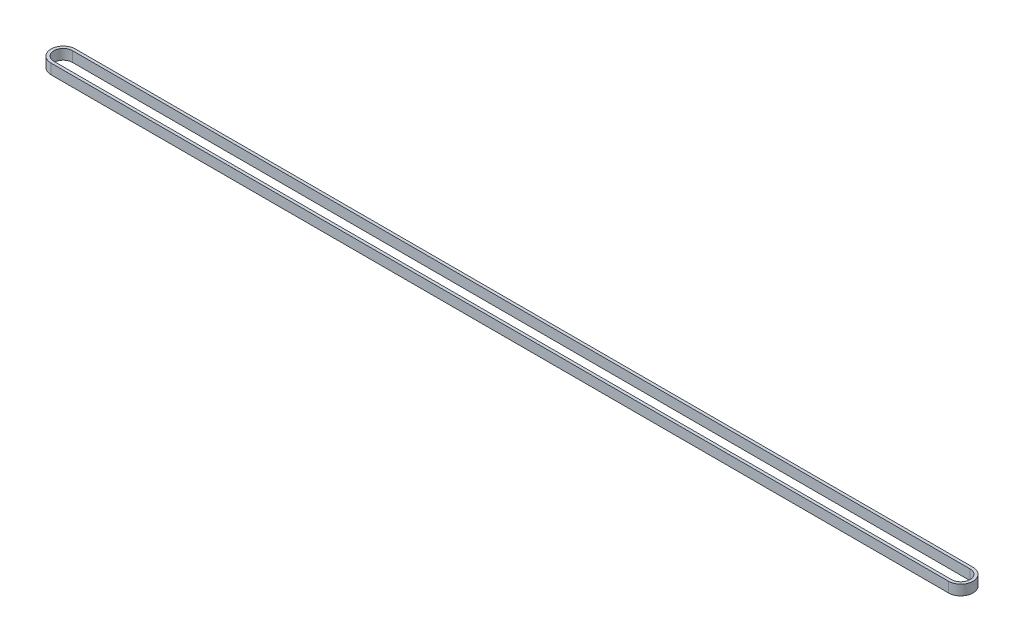
ISO-10303-21;
HEADER;
FILE_DESCRIPTION(('STEP AP214'),'2;1');
FILE_NAME('part.step','',(''),(''),'','','');
FILE_SCHEMA(('AUTOMOTIVE_DESIGN { 1 0 10303 214 1 1 1 1 }'));
ENDSEC;
DATA;
#1=APPLICATION_CONTEXT('core data for automotive mechanical design processes');
#2=APPLICATION_PROTOCOL_DEFINITION('international standard','automotive_design',2000,#1);
#3=PRODUCT_CONTEXT('',#1,'mechanical');
#4=PRODUCT('Part','Part','',(#3));
#5=PRODUCT_RELATED_PRODUCT_CATEGORY('part','',(#4));
#6=PRODUCT_DEFINITION_FORMATION('','',#4);
#7=PRODUCT_DEFINITION_CONTEXT('part definition',#1,'design');
#8=PRODUCT_DEFINITION('design','',#6,#7);
#9=PRODUCT_DEFINITION_SHAPE('','',#8);
#10=(LENGTH_UNIT() NAMED_UNIT(*) SI_UNIT(.MILLI.,.METRE.));
#11=(NAMED_UNIT(*) PLANE_ANGLE_UNIT() SI_UNIT($,.RADIAN.));
#12=(NAMED_UNIT(*) SI_UNIT($,.STERADIAN.) SOLID_ANGLE_UNIT());
#13=UNCERTAINTY_MEASURE_WITH_UNIT(LENGTH_MEASURE(1.E-05),#10,'distance_accuracy_value','');
#14=(GEOMETRIC_REPRESENTATION_CONTEXT(3) GLOBAL_UNCERTAINTY_ASSIGNED_CONTEXT((#13)) GLOBAL_UNIT_ASSIGNED_CONTEXT((#10,
#11,#12)) REPRESENTATION_CONTEXT('',''));
#15=CARTESIAN_POINT('',(0.,0.,0.));
#16=DIRECTION('',(0.,0.,1.));
#17=DIRECTION('',(1.,0.,0.));
#18=AXIS2_PLACEMENT_3D('',#15,#16,#17);
#19=CARTESIAN_POINT('',(0.,7.,0.));
#20=DIRECTION('',(0.,1.,0.));
#21=DIRECTION('',(0.,0.,1.));
#22=AXIS2_PLACEMENT_3D('',#19,#20,#21);
#23=PLANE('',#22);
#24=CARTESIAN_POINT('',(0.,7.,0.));
#25=DIRECTION('',(0.,1.,0.));
#26=DIRECTION('',(0.,0.,1.));
#27=AXIS2_PLACEMENT_3D('',#24,#25,#26);
#28=CIRCLE('',#27,8.37);
#29=CARTESIAN_POINT('',(0.,7.,-8.37));
#30=VERTEX_POINT('',#29);
#31=CARTESIAN_POINT('',(0.,7.,8.37));
#32=VERTEX_POINT('',#31);
#33=EDGE_CURVE('E134',#30,#32,#28,.T.);
#34=ORIENTED_EDGE('',*,*,#33,.T.);
#35=DIRECTION('',(1.,0.,0.));
#36=VECTOR('',#35,1.);
#37=CARTESIAN_POINT('',(0.,7.,8.37));
#38=LINE('',#37,#36);
#39=CARTESIAN_POINT('',(616.37,7.,8.37));
#40=VERTEX_POINT('',#39);
#41=EDGE_CURVE('E137',#32,#40,#38,.T.);
#42=ORIENTED_EDGE('',*,*,#41,.T.);
#43=CARTESIAN_POINT('',(616.37,7.,0.));
#44=DIRECTION('',(0.,1.,0.));
#45=DIRECTION('',(0.,0.,1.));
#46=AXIS2_PLACEMENT_3D('',#43,#44,#45);
#47=CIRCLE('',#46,8.37);
#48=CARTESIAN_POINT('',(616.37,7.,-8.37));
#49=VERTEX_POINT('',#48);
#50=EDGE_CURVE('E140',#40,#49,#47,.T.);
#51=ORIENTED_EDGE('',*,*,#50,.T.);
#52=DIRECTION('',(-1.,0.,0.));
#53=VECTOR('',#52,1.);
#54=CARTESIAN_POINT('',(0.,7.,-8.37));
#55=LINE('',#54,#53);
#56=EDGE_CURVE('E142',#49,#30,#55,.T.);
#57=ORIENTED_EDGE('',*,*,#56,.T.);
#58=EDGE_LOOP('',(#34,#42,#51,#57));
#59=FACE_BOUND('',#58,.T.);
#60=DIRECTION('',(-1.,0.,0.));
#61=VECTOR('',#60,1.);
#62=CARTESIAN_POINT('',(0.,7.,-6.37));
#63=LINE('',#62,#61);
#64=CARTESIAN_POINT('',(616.37,7.,-6.37));
#65=VERTEX_POINT('',#64);
#66=CARTESIAN_POINT('',(0.,7.,-6.37));
#67=VERTEX_POINT('',#66);
#68=EDGE_CURVE('E106',#65,#67,#63,.T.);
#69=ORIENTED_EDGE('',*,*,#68,.F.);
#70=CARTESIAN_POINT('',(616.37,7.,0.));
#71=DIRECTION('',(0.,1.,0.));
#72=DIRECTION('',(0.,0.,1.));
#73=AXIS2_PLACEMENT_3D('',#70,#71,#72);
#74=CIRCLE('',#73,6.37);
#75=CARTESIAN_POINT('',(616.37,7.,6.37));
#76=VERTEX_POINT('',#75);
#77=EDGE_CURVE('E98',#76,#65,#74,.T.);
#78=ORIENTED_EDGE('',*,*,#77,.F.);
#79=DIRECTION('',(1.,0.,0.));
#80=VECTOR('',#79,1.);
#81=CARTESIAN_POINT('',(0.,7.,6.37));
#82=LINE('',#81,#80);
#83=CARTESIAN_POINT('',(0.,7.,6.37));
#84=VERTEX_POINT('',#83);
#85=EDGE_CURVE('E120',#84,#76,#82,.T.);
#86=ORIENTED_EDGE('',*,*,#85,.F.);
#87=CARTESIAN_POINT('',(0.,7.,0.));
#88=DIRECTION('',(0.,1.,0.));
#89=DIRECTION('',(0.,0.,1.));
#90=AXIS2_PLACEMENT_3D('',#87,#88,#89);
#91=CIRCLE('',#90,6.37);
#92=EDGE_CURVE('E118',#67,#84,#91,.T.);
#93=ORIENTED_EDGE('',*,*,#92,.F.);
#94=EDGE_LOOP('',(#69,#78,#86,#93));
#95=FACE_BOUND('',#94,.T.);
#96=ADVANCED_FACE('F33',(#59,#95),#23,.T.);
#97=CARTESIAN_POINT('',(0.,0.,0.));
#98=DIRECTION('',(0.,1.,0.));
#99=DIRECTION('',(0.,0.,1.));
#100=AXIS2_PLACEMENT_3D('',#97,#98,#99);
#101=PLANE('',#100);
#102=CARTESIAN_POINT('',(0.,0.,0.));
#103=DIRECTION('',(0.,1.,0.));
#104=DIRECTION('',(0.,0.,1.));
#105=AXIS2_PLACEMENT_3D('',#102,#103,#104);
#106=CIRCLE('',#105,8.37);
#107=CARTESIAN_POINT('',(0.,0.,-8.37));
#108=VERTEX_POINT('',#107);
#109=CARTESIAN_POINT('',(0.,0.,8.37));
#110=VERTEX_POINT('',#109);
#111=EDGE_CURVE('E114',#108,#110,#106,.T.);
#112=ORIENTED_EDGE('',*,*,#111,.F.);
#113=DIRECTION('',(-1.,0.,0.));
#114=VECTOR('',#113,1.);
#115=CARTESIAN_POINT('',(0.,0.,-8.37));
#116=LINE('',#115,#114);
#117=CARTESIAN_POINT('',(616.37,0.,-8.37));
#118=VERTEX_POINT('',#117);
#119=EDGE_CURVE('E138',#118,#108,#116,.T.);
#120=ORIENTED_EDGE('',*,*,#119,.F.);
#121=CARTESIAN_POINT('',(616.37,0.,0.));
#122=DIRECTION('',(0.,1.,0.));
#123=DIRECTION('',(0.,0.,1.));
#124=AXIS2_PLACEMENT_3D('',#121,#122,#123);
#125=CIRCLE('',#124,8.37);
#126=CARTESIAN_POINT('',(616.37,0.,8.37));
#127=VERTEX_POINT('',#126);
#128=EDGE_CURVE('E149',#127,#118,#125,.T.);
#129=ORIENTED_EDGE('',*,*,#128,.F.);
#130=DIRECTION('',(1.,0.,0.));
#131=VECTOR('',#130,1.);
#132=CARTESIAN_POINT('',(0.,0.,8.37));
#133=LINE('',#132,#131);
#134=EDGE_CURVE('E147',#110,#127,#133,.T.);
#135=ORIENTED_EDGE('',*,*,#134,.F.);
#136=EDGE_LOOP('',(#112,#120,#129,#135));
#137=FACE_BOUND('',#136,.T.);
#138=CARTESIAN_POINT('',(616.37,0.,0.));
#139=DIRECTION('',(0.,1.,0.));
#140=DIRECTION('',(0.,0.,1.));
#141=AXIS2_PLACEMENT_3D('',#138,#139,#140);
#142=CIRCLE('',#141,6.37);
#143=CARTESIAN_POINT('',(616.37,0.,6.37));
#144=VERTEX_POINT('',#143);
#145=CARTESIAN_POINT('',(616.37,0.,-6.37));
#146=VERTEX_POINT('',#145);
#147=EDGE_CURVE('E56',#144,#146,#142,.T.);
#148=ORIENTED_EDGE('',*,*,#147,.T.);
#149=DIRECTION('',(-1.,0.,0.));
#150=VECTOR('',#149,1.);
#151=CARTESIAN_POINT('',(0.,0.,-6.37));
#152=LINE('',#151,#150);
#153=CARTESIAN_POINT('',(0.,0.,-6.37));
#154=VERTEX_POINT('',#153);
#155=EDGE_CURVE('E113',#146,#154,#152,.T.);
#156=ORIENTED_EDGE('',*,*,#155,.T.);
#157=CARTESIAN_POINT('',(0.,0.,0.));
#158=DIRECTION('',(0.,1.,0.));
#159=DIRECTION('',(0.,0.,1.));
#160=AXIS2_PLACEMENT_3D('',#157,#158,#159);
#161=CIRCLE('',#160,6.37);
#162=CARTESIAN_POINT('',(0.,0.,6.37));
#163=VERTEX_POINT('',#162);
#164=EDGE_CURVE('E126',#154,#163,#161,.T.);
#165=ORIENTED_EDGE('',*,*,#164,.T.);
#166=DIRECTION('',(1.,0.,0.));
#167=VECTOR('',#166,1.);
#168=CARTESIAN_POINT('',(0.,0.,6.37));
#169=LINE('',#168,#167);
#170=EDGE_CURVE('E107',#163,#144,#169,.T.);
#171=ORIENTED_EDGE('',*,*,#170,.T.);
#172=EDGE_LOOP('',(#148,#156,#165,#171));
#173=FACE_BOUND('',#172,.T.);
#174=ADVANCED_FACE('F167',(#137,#173),#101,.F.);
#175=CARTESIAN_POINT('',(0.,7.,0.));
#176=DIRECTION('',(0.,-1.,0.));
#177=DIRECTION('',(0.,0.,-1.));
#178=AXIS2_PLACEMENT_3D('',#175,#176,#177);
#179=CYLINDRICAL_SURFACE('',#178,8.37);
#180=ORIENTED_EDGE('',*,*,#111,.T.);
#181=DIRECTION('',(0.,-1.,0.));
#182=VECTOR('',#181,1.);
#183=CARTESIAN_POINT('',(0.,7.,8.37));
#184=LINE('',#183,#182);
#185=EDGE_CURVE('E11',#32,#110,#184,.T.);
#186=ORIENTED_EDGE('',*,*,#185,.F.);
#187=ORIENTED_EDGE('',*,*,#33,.F.);
#188=DIRECTION('',(0.,-1.,0.));
#189=VECTOR('',#188,1.);
#190=CARTESIAN_POINT('',(0.,7.,-8.37));
#191=LINE('',#190,#189);
#192=EDGE_CURVE('E144',#30,#108,#191,.T.);
#193=ORIENTED_EDGE('',*,*,#192,.T.);
#194=EDGE_LOOP('',(#180,#186,#187,#193));
#195=FACE_BOUND('',#194,.T.);
#196=ADVANCED_FACE('F35',(#195),#179,.T.);
#197=CARTESIAN_POINT('',(0.,7.,8.37));
#198=DIRECTION('',(0.,0.,-1.));
#199=DIRECTION('',(-1.,0.,0.));
#200=AXIS2_PLACEMENT_3D('',#197,#198,#199);
#201=PLANE('',#200);
#202=ORIENTED_EDGE('',*,*,#134,.T.);
#203=DIRECTION('',(0.,-1.,0.));
#204=VECTOR('',#203,1.);
#205=CARTESIAN_POINT('',(616.37,7.,8.37));
#206=LINE('',#205,#204);
#207=EDGE_CURVE('E41',#40,#127,#206,.T.);
#208=ORIENTED_EDGE('',*,*,#207,.F.);
#209=ORIENTED_EDGE('',*,*,#41,.F.);
#210=ORIENTED_EDGE('',*,*,#185,.T.);
#211=EDGE_LOOP('',(#202,#208,#209,#210));
#212=FACE_BOUND('',#211,.T.);
#213=ADVANCED_FACE('F177',(#212),#201,.F.);
#214=CARTESIAN_POINT('',(616.37,7.,0.));
#215=DIRECTION('',(0.,-1.,0.));
#216=DIRECTION('',(0.,0.,-1.));
#217=AXIS2_PLACEMENT_3D('',#214,#215,#216);
#218=CYLINDRICAL_SURFACE('',#217,8.37);
#219=ORIENTED_EDGE('',*,*,#128,.T.);
#220=DIRECTION('',(0.,-1.,0.));
#221=VECTOR('',#220,1.);
#222=CARTESIAN_POINT('',(616.37,7.,-8.37));
#223=LINE('',#222,#221);
#224=EDGE_CURVE('E154',#49,#118,#223,.T.);
#225=ORIENTED_EDGE('',*,*,#224,.F.);
#226=ORIENTED_EDGE('',*,*,#50,.F.);
#227=ORIENTED_EDGE('',*,*,#207,.T.);
#228=EDGE_LOOP('',(#219,#225,#226,#227));
#229=FACE_BOUND('',#228,.T.);
#230=ADVANCED_FACE('F161',(#229),#218,.T.);
#231=CARTESIAN_POINT('',(0.,7.,-8.37));
#232=DIRECTION('',(0.,0.,1.));
#233=DIRECTION('',(1.,0.,0.));
#234=AXIS2_PLACEMENT_3D('',#231,#232,#233);
#235=PLANE('',#234);
#236=ORIENTED_EDGE('',*,*,#119,.T.);
#237=ORIENTED_EDGE('',*,*,#192,.F.);
#238=ORIENTED_EDGE('',*,*,#56,.F.);
#239=ORIENTED_EDGE('',*,*,#224,.T.);
#240=EDGE_LOOP('',(#236,#237,#238,#239));
#241=FACE_BOUND('',#240,.T.);
#242=ADVANCED_FACE('F171',(#241),#235,.F.);
#243=CARTESIAN_POINT('',(616.37,7.,0.));
#244=DIRECTION('',(0.,-1.,0.));
#245=DIRECTION('',(0.,0.,-1.));
#246=AXIS2_PLACEMENT_3D('',#243,#244,#245);
#247=CYLINDRICAL_SURFACE('',#246,6.37);
#248=ORIENTED_EDGE('',*,*,#147,.F.);
#249=DIRECTION('',(0.,-1.,0.));
#250=VECTOR('',#249,1.);
#251=CARTESIAN_POINT('',(616.37,7.,6.37));
#252=LINE('',#251,#250);
#253=EDGE_CURVE('E102',#76,#144,#252,.T.);
#254=ORIENTED_EDGE('',*,*,#253,.F.);
#255=ORIENTED_EDGE('',*,*,#77,.T.);
#256=DIRECTION('',(0.,-1.,0.));
#257=VECTOR('',#256,1.);
#258=CARTESIAN_POINT('',(616.37,7.,-6.37));
#259=LINE('',#258,#257);
#260=EDGE_CURVE('E101',#65,#146,#259,.T.);
#261=ORIENTED_EDGE('',*,*,#260,.T.);
#262=EDGE_LOOP('',(#248,#254,#255,#261));
#263=FACE_BOUND('',#262,.T.);
#264=ADVANCED_FACE('F100',(#263),#247,.F.);
#265=CARTESIAN_POINT('',(0.,7.,-6.37));
#266=DIRECTION('',(0.,0.,1.));
#267=DIRECTION('',(1.,0.,0.));
#268=AXIS2_PLACEMENT_3D('',#265,#266,#267);
#269=PLANE('',#268);
#270=ORIENTED_EDGE('',*,*,#155,.F.);
#271=ORIENTED_EDGE('',*,*,#260,.F.);
#272=ORIENTED_EDGE('',*,*,#68,.T.);
#273=DIRECTION('',(0.,-1.,0.));
#274=VECTOR('',#273,1.);
#275=CARTESIAN_POINT('',(0.,7.,-6.37));
#276=LINE('',#275,#274);
#277=EDGE_CURVE('E115',#67,#154,#276,.T.);
#278=ORIENTED_EDGE('',*,*,#277,.T.);
#279=EDGE_LOOP('',(#270,#271,#272,#278));
#280=FACE_BOUND('',#279,.T.);
#281=ADVANCED_FACE('F110',(#280),#269,.T.);
#282=CARTESIAN_POINT('',(0.,7.,0.));
#283=DIRECTION('',(0.,-1.,0.));
#284=DIRECTION('',(0.,0.,-1.));
#285=AXIS2_PLACEMENT_3D('',#282,#283,#284);
#286=CYLINDRICAL_SURFACE('',#285,6.37);
#287=ORIENTED_EDGE('',*,*,#164,.F.);
#288=ORIENTED_EDGE('',*,*,#277,.F.);
#289=ORIENTED_EDGE('',*,*,#92,.T.);
#290=DIRECTION('',(0.,-1.,0.));
#291=VECTOR('',#290,1.);
#292=CARTESIAN_POINT('',(0.,7.,6.37));
#293=LINE('',#292,#291);
#294=EDGE_CURVE('E48',#84,#163,#293,.T.);
#295=ORIENTED_EDGE('',*,*,#294,.T.);
#296=EDGE_LOOP('',(#287,#288,#289,#295));
#297=FACE_BOUND('',#296,.T.);
#298=ADVANCED_FACE('F200',(#297),#286,.F.);
#299=CARTESIAN_POINT('',(0.,7.,6.37));
#300=DIRECTION('',(0.,0.,-1.));
#301=DIRECTION('',(-1.,0.,0.));
#302=AXIS2_PLACEMENT_3D('',#299,#300,#301);
#303=PLANE('',#302);
#304=ORIENTED_EDGE('',*,*,#170,.F.);
#305=ORIENTED_EDGE('',*,*,#294,.F.);
#306=ORIENTED_EDGE('',*,*,#85,.T.);
#307=ORIENTED_EDGE('',*,*,#253,.T.);
#308=EDGE_LOOP('',(#304,#305,#306,#307));
#309=FACE_BOUND('',#308,.T.);
#310=ADVANCED_FACE('F204',(#309),#303,.T.);
#311=CLOSED_SHELL('',(#96,#174,#196,#213,#230,#242,#264,#281,#298,#310));
#312=MANIFOLD_SOLID_BREP('B2',#311);
#313=ADVANCED_BREP_SHAPE_REPRESENTATION('',(#18,#312),#14);
#314=SHAPE_DEFINITION_REPRESENTATION(#9,#313);
ENDSEC;
END-ISO-10303-21;
